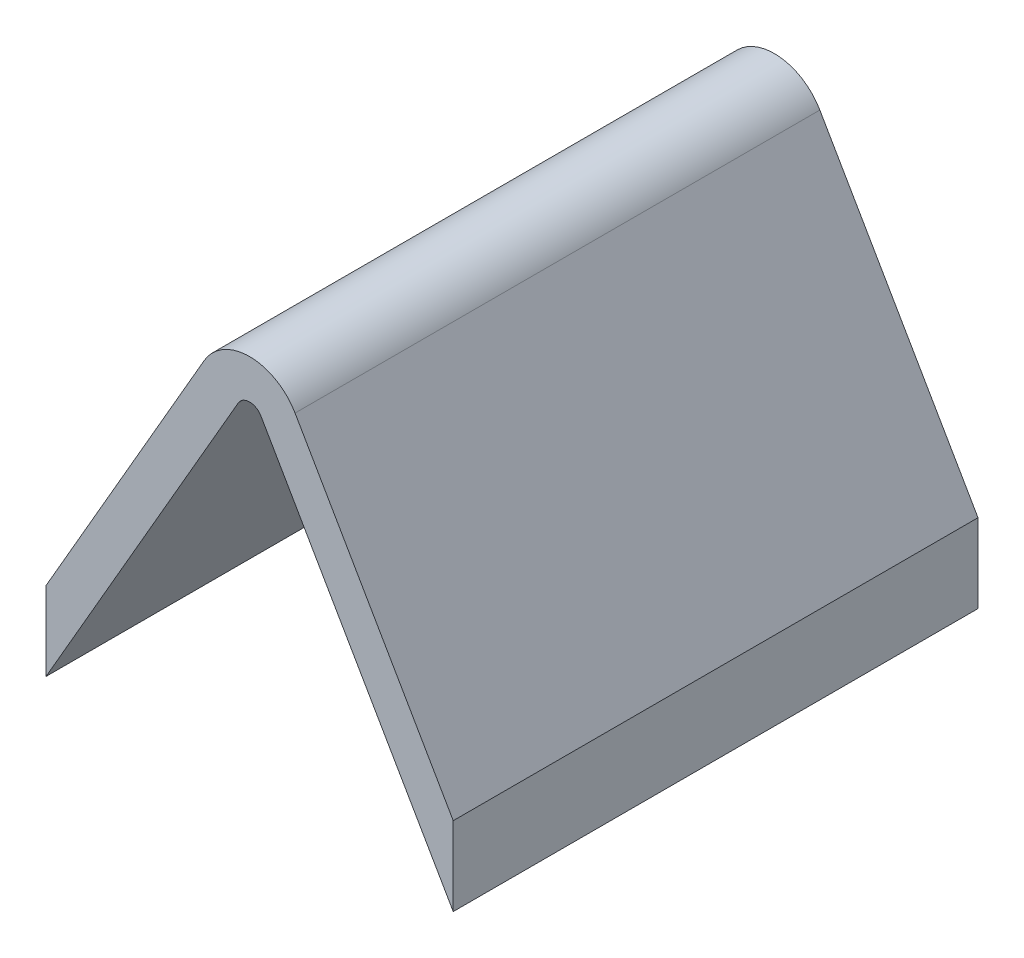
ISO-10303-21;
HEADER;
FILE_DESCRIPTION(('STEP AP214'),'2;1');
FILE_NAME('part.step','',(''),(''),'','','');
FILE_SCHEMA(('AUTOMOTIVE_DESIGN { 1 0 10303 214 1 1 1 1 }'));
ENDSEC;
DATA;
#1=APPLICATION_CONTEXT('core data for automotive mechanical design processes');
#2=APPLICATION_PROTOCOL_DEFINITION('international standard','automotive_design',2000,#1);
#3=PRODUCT_CONTEXT('',#1,'mechanical');
#4=PRODUCT('Part','Part','',(#3));
#5=PRODUCT_RELATED_PRODUCT_CATEGORY('part','',(#4));
#6=PRODUCT_DEFINITION_FORMATION('','',#4);
#7=PRODUCT_DEFINITION_CONTEXT('part definition',#1,'design');
#8=PRODUCT_DEFINITION('design','',#6,#7);
#9=PRODUCT_DEFINITION_SHAPE('','',#8);
#10=(LENGTH_UNIT() NAMED_UNIT(*) SI_UNIT(.MILLI.,.METRE.));
#11=(NAMED_UNIT(*) PLANE_ANGLE_UNIT() SI_UNIT($,.RADIAN.));
#12=(NAMED_UNIT(*) SI_UNIT($,.STERADIAN.) SOLID_ANGLE_UNIT());
#13=UNCERTAINTY_MEASURE_WITH_UNIT(LENGTH_MEASURE(1.E-05),#10,'distance_accuracy_value','');
#14=(GEOMETRIC_REPRESENTATION_CONTEXT(3) GLOBAL_UNCERTAINTY_ASSIGNED_CONTEXT((#13)) GLOBAL_UNIT_ASSIGNED_CONTEXT((#10,
#11,#12)) REPRESENTATION_CONTEXT('',''));
#15=CARTESIAN_POINT('',(0.,0.,0.));
#16=DIRECTION('',(0.,0.,1.));
#17=DIRECTION('',(1.,0.,0.));
#18=AXIS2_PLACEMENT_3D('',#15,#16,#17);
#19=CARTESIAN_POINT('',(0.,125.903810567665,200.));
#20=DIRECTION('',(0.,0.,-1.));
#21=DIRECTION('',(-1.,0.,0.));
#22=AXIS2_PLACEMENT_3D('',#19,#20,#21);
#23=CYLINDRICAL_SURFACE('',#22,5.00000000000001);
#24=CARTESIAN_POINT('',(0.,125.903810567665,0.));
#25=DIRECTION('',(0.,0.,-1.));
#26=DIRECTION('',(-1.,0.,0.));
#27=AXIS2_PLACEMENT_3D('',#24,#25,#26);
#28=CIRCLE('',#27,5.00000000000001);
#29=CARTESIAN_POINT('',(-4.3301270189222,128.403810567665,0.));
#30=VERTEX_POINT('',#29);
#31=CARTESIAN_POINT('',(4.33012701892221,128.403810567665,0.));
#32=VERTEX_POINT('',#31);
#33=EDGE_CURVE('E131',#30,#32,#28,.T.);
#34=ORIENTED_EDGE('',*,*,#33,.T.);
#35=DIRECTION('',(0.,0.,-1.));
#36=VECTOR('',#35,1.);
#37=CARTESIAN_POINT('',(4.33012701892221,128.403810567665,200.));
#38=LINE('',#37,#36);
#39=CARTESIAN_POINT('',(4.33012701892221,128.403810567665,200.));
#40=VERTEX_POINT('',#39);
#41=EDGE_CURVE('E11',#40,#32,#38,.T.);
#42=ORIENTED_EDGE('',*,*,#41,.F.);
#43=CARTESIAN_POINT('',(0.,125.903810567665,200.));
#44=DIRECTION('',(0.,0.,-1.));
#45=DIRECTION('',(-1.,0.,0.));
#46=AXIS2_PLACEMENT_3D('',#43,#44,#45);
#47=CIRCLE('',#46,5.00000000000001);
#48=CARTESIAN_POINT('',(-4.3301270189222,128.403810567665,200.));
#49=VERTEX_POINT('',#48);
#50=EDGE_CURVE('E145',#49,#40,#47,.T.);
#51=ORIENTED_EDGE('',*,*,#50,.F.);
#52=DIRECTION('',(0.,0.,-1.));
#53=VECTOR('',#52,1.);
#54=CARTESIAN_POINT('',(-4.3301270189222,128.403810567665,200.));
#55=LINE('',#54,#53);
#56=EDGE_CURVE('E127',#49,#30,#55,.T.);
#57=ORIENTED_EDGE('',*,*,#56,.T.);
#58=EDGE_LOOP('',(#34,#42,#51,#57));
#59=FACE_BOUND('',#58,.T.);
#60=ADVANCED_FACE('F35',(#59),#23,.F.);
#61=CARTESIAN_POINT('',(4.33012701892221,128.403810567665,200.));
#62=DIRECTION('',(0.866025403784438,0.500000000000001,0.));
#63=DIRECTION('',(-0.500000000000001,0.866025403784438,0.));
#64=AXIS2_PLACEMENT_3D('',#61,#62,#63);
#65=PLANE('',#64);
#66=DIRECTION('',(0.500000000000001,-0.866025403784438,0.));
#67=VECTOR('',#66,1.);
#68=CARTESIAN_POINT('',(4.33012701892221,128.403810567665,0.));
#69=LINE('',#68,#67);
#70=CARTESIAN_POINT('',(77.5980762113533,1.50000000000003,0.));
#71=VERTEX_POINT('',#70);
#72=EDGE_CURVE('E134',#32,#71,#69,.T.);
#73=ORIENTED_EDGE('',*,*,#72,.T.);
#74=DIRECTION('',(0.,0.,-1.));
#75=VECTOR('',#74,1.);
#76=CARTESIAN_POINT('',(77.5980762113533,1.50000000000003,200.));
#77=LINE('',#76,#75);
#78=CARTESIAN_POINT('',(77.5980762113533,1.50000000000003,200.));
#79=VERTEX_POINT('',#78);
#80=EDGE_CURVE('E43',#79,#71,#77,.T.);
#81=ORIENTED_EDGE('',*,*,#80,.F.);
#82=DIRECTION('',(0.500000000000001,-0.866025403784438,0.));
#83=VECTOR('',#82,1.);
#84=CARTESIAN_POINT('',(4.33012701892221,128.403810567665,200.));
#85=LINE('',#84,#83);
#86=EDGE_CURVE('E94',#40,#79,#85,.T.);
#87=ORIENTED_EDGE('',*,*,#86,.F.);
#88=ORIENTED_EDGE('',*,*,#41,.T.);
#89=EDGE_LOOP('',(#73,#81,#87,#88));
#90=FACE_BOUND('',#89,.T.);
#91=ADVANCED_FACE('F180',(#90),#65,.F.);
#92=CARTESIAN_POINT('',(77.5980762113533,1.50000000000003,200.));
#93=DIRECTION('',(-1.,0.,0.));
#94=DIRECTION('',(0.,0.,1.));
#95=AXIS2_PLACEMENT_3D('',#92,#93,#94);
#96=PLANE('',#95);
#97=DIRECTION('',(0.,1.,0.));
#98=VECTOR('',#97,1.);
#99=CARTESIAN_POINT('',(77.5980762113533,1.50000000000003,0.));
#100=LINE('',#99,#98);
#101=CARTESIAN_POINT('',(77.5980762113533,31.4999999999999,0.));
#102=VERTEX_POINT('',#101);
#103=EDGE_CURVE('E136',#71,#102,#100,.T.);
#104=ORIENTED_EDGE('',*,*,#103,.T.);
#105=DIRECTION('',(0.,0.,-1.));
#106=VECTOR('',#105,1.);
#107=CARTESIAN_POINT('',(77.5980762113533,31.4999999999999,200.));
#108=LINE('',#107,#106);
#109=CARTESIAN_POINT('',(77.5980762113533,31.4999999999999,200.));
#110=VERTEX_POINT('',#109);
#111=EDGE_CURVE('E152',#110,#102,#108,.T.);
#112=ORIENTED_EDGE('',*,*,#111,.F.);
#113=DIRECTION('',(0.,1.,0.));
#114=VECTOR('',#113,1.);
#115=CARTESIAN_POINT('',(77.5980762113533,1.50000000000003,200.));
#116=LINE('',#115,#114);
#117=EDGE_CURVE('E160',#79,#110,#116,.T.);
#118=ORIENTED_EDGE('',*,*,#117,.F.);
#119=ORIENTED_EDGE('',*,*,#80,.T.);
#120=EDGE_LOOP('',(#104,#112,#118,#119));
#121=FACE_BOUND('',#120,.T.);
#122=ADVANCED_FACE('F158',(#121),#96,.F.);
#123=CARTESIAN_POINT('',(77.5980762113533,31.4999999999999,200.));
#124=DIRECTION('',(-0.866025403784438,-0.500000000000001,0.));
#125=DIRECTION('',(0.500000000000001,-0.866025403784438,0.));
#126=AXIS2_PLACEMENT_3D('',#123,#124,#125);
#127=PLANE('',#126);
#128=DIRECTION('',(-0.500000000000001,0.866025403784438,0.));
#129=VECTOR('',#128,1.);
#130=CARTESIAN_POINT('',(77.5980762113533,31.4999999999999,0.));
#131=LINE('',#130,#129);
#132=CARTESIAN_POINT('',(17.3205080756888,135.903810567665,0.));
#133=VERTEX_POINT('',#132);
#134=EDGE_CURVE('E138',#102,#133,#131,.T.);
#135=ORIENTED_EDGE('',*,*,#134,.T.);
#136=DIRECTION('',(0.,0.,-1.));
#137=VECTOR('',#136,1.);
#138=CARTESIAN_POINT('',(17.3205080756888,135.903810567665,200.));
#139=LINE('',#138,#137);
#140=CARTESIAN_POINT('',(17.3205080756888,135.903810567665,200.));
#141=VERTEX_POINT('',#140);
#142=EDGE_CURVE('E149',#141,#133,#139,.T.);
#143=ORIENTED_EDGE('',*,*,#142,.F.);
#144=DIRECTION('',(-0.500000000000001,0.866025403784438,0.));
#145=VECTOR('',#144,1.);
#146=CARTESIAN_POINT('',(77.5980762113533,31.4999999999999,200.));
#147=LINE('',#146,#145);
#148=EDGE_CURVE('E172',#110,#141,#147,.T.);
#149=ORIENTED_EDGE('',*,*,#148,.F.);
#150=ORIENTED_EDGE('',*,*,#111,.T.);
#151=EDGE_LOOP('',(#135,#143,#149,#150));
#152=FACE_BOUND('',#151,.T.);
#153=ADVANCED_FACE('F168',(#152),#127,.F.);
#154=CARTESIAN_POINT('',(0.,125.903810567665,200.));
#155=DIRECTION('',(0.,0.,-1.));
#156=DIRECTION('',(-1.,0.,0.));
#157=AXIS2_PLACEMENT_3D('',#154,#155,#156);
#158=CYLINDRICAL_SURFACE('',#157,20.);
#159=CARTESIAN_POINT('',(0.,125.903810567665,0.));
#160=DIRECTION('',(0.,0.,1.));
#161=DIRECTION('',(-1.,0.,0.));
#162=AXIS2_PLACEMENT_3D('',#159,#160,#161);
#163=CIRCLE('',#162,20.);
#164=CARTESIAN_POINT('',(-17.3205080756888,135.903810567665,0.));
#165=VERTEX_POINT('',#164);
#166=EDGE_CURVE('E140',#133,#165,#163,.T.);
#167=ORIENTED_EDGE('',*,*,#166,.T.);
#168=DIRECTION('',(0.,0.,-1.));
#169=VECTOR('',#168,1.);
#170=CARTESIAN_POINT('',(-17.3205080756888,135.903810567665,200.));
#171=LINE('',#170,#169);
#172=CARTESIAN_POINT('',(-17.3205080756888,135.903810567665,200.));
#173=VERTEX_POINT('',#172);
#174=EDGE_CURVE('E122',#173,#165,#171,.T.);
#175=ORIENTED_EDGE('',*,*,#174,.F.);
#176=CARTESIAN_POINT('',(0.,125.903810567665,200.));
#177=DIRECTION('',(0.,0.,1.));
#178=DIRECTION('',(-1.,0.,0.));
#179=AXIS2_PLACEMENT_3D('',#176,#177,#178);
#180=CIRCLE('',#179,20.);
#181=EDGE_CURVE('E113',#141,#173,#180,.T.);
#182=ORIENTED_EDGE('',*,*,#181,.F.);
#183=ORIENTED_EDGE('',*,*,#142,.T.);
#184=EDGE_LOOP('',(#167,#175,#182,#183));
#185=FACE_BOUND('',#184,.T.);
#186=ADVANCED_FACE('F171',(#185),#158,.T.);
#187=CARTESIAN_POINT('',(-77.5980762113533,31.4999999999999,200.));
#188=DIRECTION('',(0.866025403784438,-0.500000000000001,0.));
#189=DIRECTION('',(0.500000000000001,0.866025403784438,0.));
#190=AXIS2_PLACEMENT_3D('',#187,#188,#189);
#191=PLANE('',#190);
#192=DIRECTION('',(-0.500000000000001,-0.866025403784438,0.));
#193=VECTOR('',#192,1.);
#194=CARTESIAN_POINT('',(-77.5980762113533,31.4999999999999,0.));
#195=LINE('',#194,#193);
#196=CARTESIAN_POINT('',(-77.5980762113533,31.4999999999999,0.));
#197=VERTEX_POINT('',#196);
#198=EDGE_CURVE('E121',#165,#197,#195,.T.);
#199=ORIENTED_EDGE('',*,*,#198,.T.);
#200=DIRECTION('',(0.,0.,-1.));
#201=VECTOR('',#200,1.);
#202=CARTESIAN_POINT('',(-77.5980762113533,31.4999999999999,200.));
#203=LINE('',#202,#201);
#204=CARTESIAN_POINT('',(-77.5980762113533,31.4999999999999,200.));
#205=VERTEX_POINT('',#204);
#206=EDGE_CURVE('E118',#205,#197,#203,.T.);
#207=ORIENTED_EDGE('',*,*,#206,.F.);
#208=DIRECTION('',(-0.500000000000001,-0.866025403784438,0.));
#209=VECTOR('',#208,1.);
#210=CARTESIAN_POINT('',(-77.5980762113533,31.4999999999999,200.));
#211=LINE('',#210,#209);
#212=EDGE_CURVE('E107',#173,#205,#211,.T.);
#213=ORIENTED_EDGE('',*,*,#212,.F.);
#214=ORIENTED_EDGE('',*,*,#174,.T.);
#215=EDGE_LOOP('',(#199,#207,#213,#214));
#216=FACE_BOUND('',#215,.T.);
#217=ADVANCED_FACE('F119',(#216),#191,.F.);
#218=CARTESIAN_POINT('',(-77.5980762113533,1.5,200.));
#219=DIRECTION('',(1.,0.,0.));
#220=DIRECTION('',(0.,1.,0.));
#221=AXIS2_PLACEMENT_3D('',#218,#219,#220);
#222=PLANE('',#221);
#223=DIRECTION('',(0.,-1.,0.));
#224=VECTOR('',#223,1.);
#225=CARTESIAN_POINT('',(-77.5980762113533,1.5,0.));
#226=LINE('',#225,#224);
#227=CARTESIAN_POINT('',(-77.5980762113533,1.5,0.));
#228=VERTEX_POINT('',#227);
#229=EDGE_CURVE('E80',#197,#228,#226,.T.);
#230=ORIENTED_EDGE('',*,*,#229,.T.);
#231=DIRECTION('',(0.,0.,-1.));
#232=VECTOR('',#231,1.);
#233=CARTESIAN_POINT('',(-77.5980762113533,1.5,200.));
#234=LINE('',#233,#232);
#235=CARTESIAN_POINT('',(-77.5980762113533,1.5,200.));
#236=VERTEX_POINT('',#235);
#237=EDGE_CURVE('E123',#236,#228,#234,.T.);
#238=ORIENTED_EDGE('',*,*,#237,.F.);
#239=DIRECTION('',(0.,-1.,0.));
#240=VECTOR('',#239,1.);
#241=CARTESIAN_POINT('',(-77.5980762113533,1.5,200.));
#242=LINE('',#241,#240);
#243=EDGE_CURVE('E111',#205,#236,#242,.T.);
#244=ORIENTED_EDGE('',*,*,#243,.F.);
#245=ORIENTED_EDGE('',*,*,#206,.T.);
#246=EDGE_LOOP('',(#230,#238,#244,#245));
#247=FACE_BOUND('',#246,.T.);
#248=ADVANCED_FACE('F125',(#247),#222,.F.);
#249=CARTESIAN_POINT('',(-77.5980762113533,1.5,200.));
#250=DIRECTION('',(-0.866025403784438,0.500000000000001,0.));
#251=DIRECTION('',(-0.500000000000001,-0.866025403784438,0.));
#252=AXIS2_PLACEMENT_3D('',#249,#250,#251);
#253=PLANE('',#252);
#254=DIRECTION('',(0.500000000000001,0.866025403784438,0.));
#255=VECTOR('',#254,1.);
#256=CARTESIAN_POINT('',(-77.5980762113533,1.5,0.));
#257=LINE('',#256,#255);
#258=EDGE_CURVE('E86',#228,#30,#257,.T.);
#259=ORIENTED_EDGE('',*,*,#258,.T.);
#260=ORIENTED_EDGE('',*,*,#56,.F.);
#261=DIRECTION('',(0.500000000000001,0.866025403784438,0.));
#262=VECTOR('',#261,1.);
#263=CARTESIAN_POINT('',(-77.5980762113533,1.5,200.));
#264=LINE('',#263,#262);
#265=EDGE_CURVE('E51',#236,#49,#264,.T.);
#266=ORIENTED_EDGE('',*,*,#265,.F.);
#267=ORIENTED_EDGE('',*,*,#237,.T.);
#268=EDGE_LOOP('',(#259,#260,#266,#267));
#269=FACE_BOUND('',#268,.T.);
#270=ADVANCED_FACE('F196',(#269),#253,.F.);
#271=CARTESIAN_POINT('',(0.,125.903810567665,200.));
#272=DIRECTION('',(0.,0.,-1.));
#273=DIRECTION('',(-1.,0.,0.));
#274=AXIS2_PLACEMENT_3D('',#271,#272,#273);
#275=PLANE('',#274);
#276=ORIENTED_EDGE('',*,*,#50,.T.);
#277=ORIENTED_EDGE('',*,*,#86,.T.);
#278=ORIENTED_EDGE('',*,*,#117,.T.);
#279=ORIENTED_EDGE('',*,*,#148,.T.);
#280=ORIENTED_EDGE('',*,*,#181,.T.);
#281=ORIENTED_EDGE('',*,*,#212,.T.);
#282=ORIENTED_EDGE('',*,*,#243,.T.);
#283=ORIENTED_EDGE('',*,*,#265,.T.);
#284=EDGE_LOOP('',(#276,#277,#278,#279,#280,#281,#282,#283));
#285=FACE_BOUND('',#284,.T.);
#286=ADVANCED_FACE('F109',(#285),#275,.F.);
#287=CARTESIAN_POINT('',(0.,125.903810567665,0.));
#288=DIRECTION('',(0.,0.,-1.));
#289=DIRECTION('',(-1.,0.,0.));
#290=AXIS2_PLACEMENT_3D('',#287,#288,#289);
#291=PLANE('',#290);
#292=ORIENTED_EDGE('',*,*,#33,.F.);
#293=ORIENTED_EDGE('',*,*,#258,.F.);
#294=ORIENTED_EDGE('',*,*,#229,.F.);
#295=ORIENTED_EDGE('',*,*,#198,.F.);
#296=ORIENTED_EDGE('',*,*,#166,.F.);
#297=ORIENTED_EDGE('',*,*,#134,.F.);
#298=ORIENTED_EDGE('',*,*,#103,.F.);
#299=ORIENTED_EDGE('',*,*,#72,.F.);
#300=EDGE_LOOP('',(#292,#293,#294,#295,#296,#297,#298,#299));
#301=FACE_BOUND('',#300,.T.);
#302=ADVANCED_FACE('F164',(#301),#291,.T.);
#303=CLOSED_SHELL('',(#60,#91,#122,#153,#186,#217,#248,#270,#286,#302));
#304=MANIFOLD_SOLID_BREP('B2',#303);
#305=ADVANCED_BREP_SHAPE_REPRESENTATION('',(#18,#304),#14);
#306=SHAPE_DEFINITION_REPRESENTATION(#9,#305);
ENDSEC;
END-ISO-10303-21;
